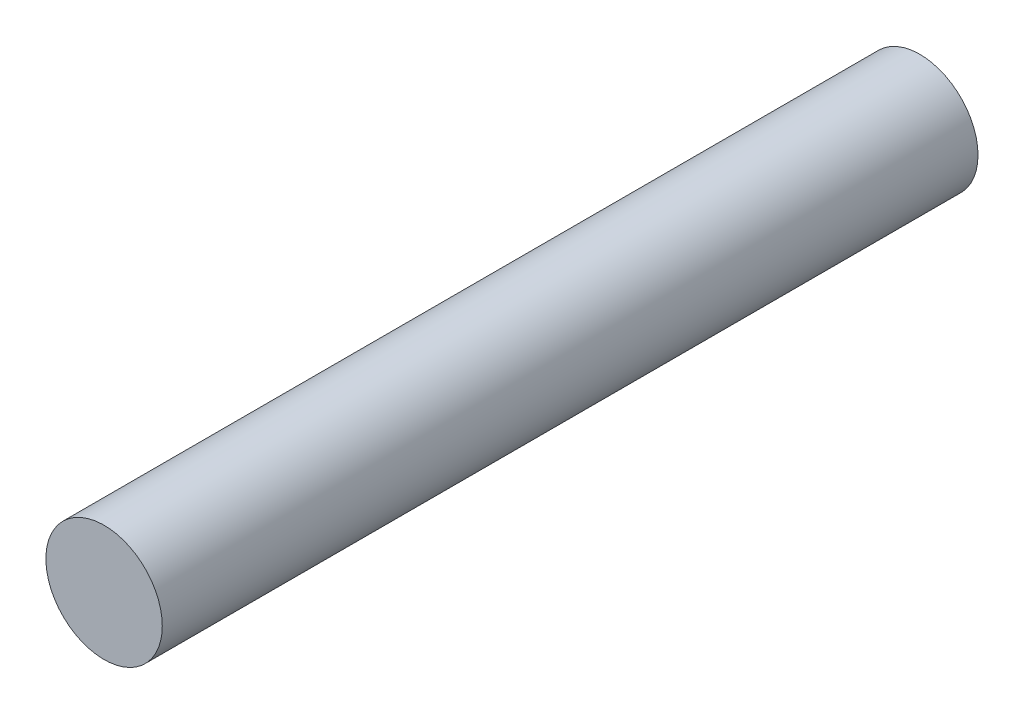
ISO-10303-21;
HEADER;
FILE_DESCRIPTION(('STEP AP214'),'2;1');
FILE_NAME('part.step','',(''),(''),'','','');
FILE_SCHEMA(('AUTOMOTIVE_DESIGN { 1 0 10303 214 1 1 1 1 }'));
ENDSEC;
DATA;
#1=APPLICATION_CONTEXT('core data for automotive mechanical design processes');
#2=APPLICATION_PROTOCOL_DEFINITION('international standard','automotive_design',2000,#1);
#3=PRODUCT_CONTEXT('',#1,'mechanical');
#4=PRODUCT('Part','Part','',(#3));
#5=PRODUCT_RELATED_PRODUCT_CATEGORY('part','',(#4));
#6=PRODUCT_DEFINITION_FORMATION('','',#4);
#7=PRODUCT_DEFINITION_CONTEXT('part definition',#1,'design');
#8=PRODUCT_DEFINITION('design','',#6,#7);
#9=PRODUCT_DEFINITION_SHAPE('','',#8);
#10=(LENGTH_UNIT() NAMED_UNIT(*) SI_UNIT(.MILLI.,.METRE.));
#11=(NAMED_UNIT(*) PLANE_ANGLE_UNIT() SI_UNIT($,.RADIAN.));
#12=(NAMED_UNIT(*) SI_UNIT($,.STERADIAN.) SOLID_ANGLE_UNIT());
#13=UNCERTAINTY_MEASURE_WITH_UNIT(LENGTH_MEASURE(1.E-05),#10,'distance_accuracy_value','');
#14=(GEOMETRIC_REPRESENTATION_CONTEXT(3) GLOBAL_UNCERTAINTY_ASSIGNED_CONTEXT((#13)) GLOBAL_UNIT_ASSIGNED_CONTEXT((#10,
#11,#12)) REPRESENTATION_CONTEXT('',''));
#15=CARTESIAN_POINT('',(0.,0.,0.));
#16=DIRECTION('',(0.,0.,1.));
#17=DIRECTION('',(1.,0.,0.));
#18=AXIS2_PLACEMENT_3D('',#15,#16,#17);
#19=CARTESIAN_POINT('',(0.,0.,202.946));
#20=DIRECTION('',(0.,0.,-1.));
#21=DIRECTION('',(-1.,0.,0.));
#22=AXIS2_PLACEMENT_3D('',#19,#20,#21);
#23=CYLINDRICAL_SURFACE('',#22,14.478);
#24=CARTESIAN_POINT('',(0.,0.,202.946));
#25=DIRECTION('',(0.,0.,1.));
#26=DIRECTION('',(1.,0.,0.));
#27=AXIS2_PLACEMENT_3D('',#24,#25,#26);
#28=CIRCLE('',#27,14.478);
#29=CARTESIAN_POINT('',(14.478,0.,202.946));
#30=VERTEX_POINT('',#29);
#31=EDGE_CURVE('E10',#30,#30,#28,.T.);
#32=ORIENTED_EDGE('',*,*,#31,.F.);
#33=EDGE_LOOP('',(#32));
#34=FACE_BOUND('',#33,.T.);
#35=CARTESIAN_POINT('',(0.,0.,0.));
#36=DIRECTION('',(0.,0.,1.));
#37=DIRECTION('',(1.,0.,0.));
#38=AXIS2_PLACEMENT_3D('',#35,#36,#37);
#39=CIRCLE('',#38,14.478);
#40=CARTESIAN_POINT('',(14.478,0.,0.));
#41=VERTEX_POINT('',#40);
#42=EDGE_CURVE('E37',#41,#41,#39,.T.);
#43=ORIENTED_EDGE('',*,*,#42,.T.);
#44=EDGE_LOOP('',(#43));
#45=FACE_BOUND('',#44,.T.);
#46=ADVANCED_FACE('F34',(#34,#45),#23,.T.);
#47=CARTESIAN_POINT('',(0.,0.,202.946));
#48=DIRECTION('',(0.,0.,1.));
#49=DIRECTION('',(1.,0.,0.));
#50=AXIS2_PLACEMENT_3D('',#47,#48,#49);
#51=PLANE('',#50);
#52=ORIENTED_EDGE('',*,*,#31,.T.);
#53=EDGE_LOOP('',(#52));
#54=FACE_BOUND('',#53,.T.);
#55=ADVANCED_FACE('F49',(#54),#51,.T.);
#56=CARTESIAN_POINT('',(0.,0.,0.));
#57=DIRECTION('',(0.,0.,1.));
#58=DIRECTION('',(1.,0.,0.));
#59=AXIS2_PLACEMENT_3D('',#56,#57,#58);
#60=PLANE('',#59);
#61=ORIENTED_EDGE('',*,*,#42,.F.);
#62=EDGE_LOOP('',(#61));
#63=FACE_BOUND('',#62,.T.);
#64=ADVANCED_FACE('F47',(#63),#60,.F.);
#65=CLOSED_SHELL('',(#46,#55,#64));
#66=MANIFOLD_SOLID_BREP('B2',#65);
#67=ADVANCED_BREP_SHAPE_REPRESENTATION('',(#18,#66),#14);
#68=SHAPE_DEFINITION_REPRESENTATION(#9,#67);
ENDSEC;
END-ISO-10303-21;
